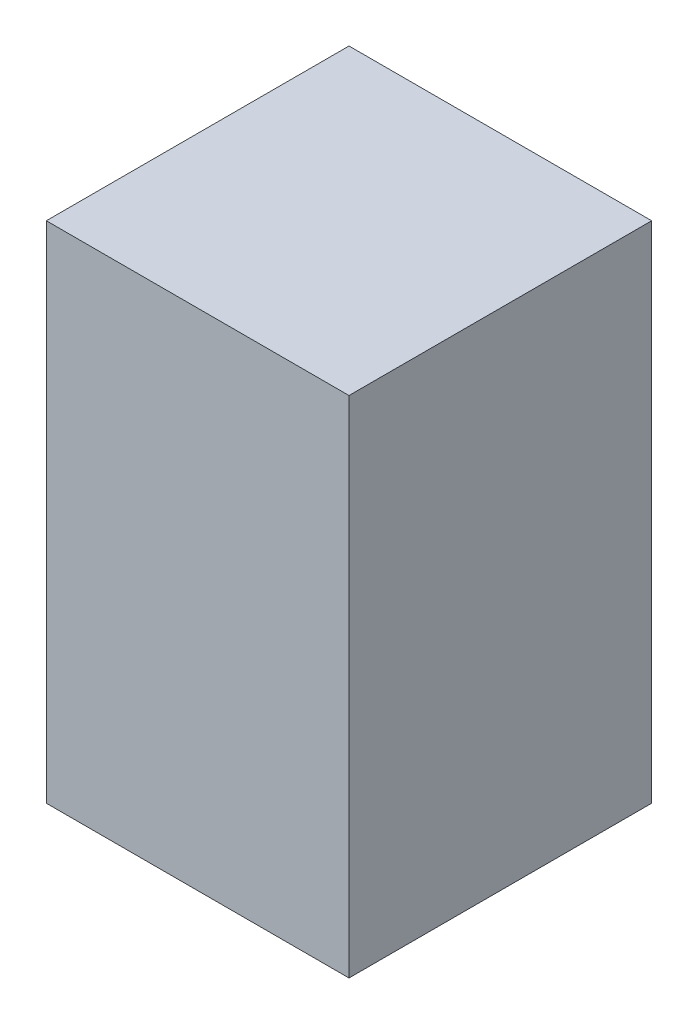
ISO-10303-21;
HEADER;
FILE_DESCRIPTION(('STEP AP214'),'2;1');
FILE_NAME('part.step','',(''),(''),'','','');
FILE_SCHEMA(('AUTOMOTIVE_DESIGN { 1 0 10303 214 1 1 1 1 }'));
ENDSEC;
DATA;
#1=APPLICATION_CONTEXT('core data for automotive mechanical design processes');
#2=APPLICATION_PROTOCOL_DEFINITION('international standard','automotive_design',2000,#1);
#3=PRODUCT_CONTEXT('',#1,'mechanical');
#4=PRODUCT('Part','Part','',(#3));
#5=PRODUCT_RELATED_PRODUCT_CATEGORY('part','',(#4));
#6=PRODUCT_DEFINITION_FORMATION('','',#4);
#7=PRODUCT_DEFINITION_CONTEXT('part definition',#1,'design');
#8=PRODUCT_DEFINITION('design','',#6,#7);
#9=PRODUCT_DEFINITION_SHAPE('','',#8);
#10=(LENGTH_UNIT() NAMED_UNIT(*) SI_UNIT(.MILLI.,.METRE.));
#11=(NAMED_UNIT(*) PLANE_ANGLE_UNIT() SI_UNIT($,.RADIAN.));
#12=(NAMED_UNIT(*) SI_UNIT($,.STERADIAN.) SOLID_ANGLE_UNIT());
#13=UNCERTAINTY_MEASURE_WITH_UNIT(LENGTH_MEASURE(1.E-05),#10,'distance_accuracy_value','');
#14=(GEOMETRIC_REPRESENTATION_CONTEXT(3) GLOBAL_UNCERTAINTY_ASSIGNED_CONTEXT((#13)) GLOBAL_UNIT_ASSIGNED_CONTEXT((#10,
#11,#12)) REPRESENTATION_CONTEXT('',''));
#15=CARTESIAN_POINT('',(0.,0.,0.));
#16=DIRECTION('',(0.,0.,1.));
#17=DIRECTION('',(1.,0.,0.));
#18=AXIS2_PLACEMENT_3D('',#15,#16,#17);
#19=CARTESIAN_POINT('',(15.,25.,30.));
#20=DIRECTION('',(-1.,0.,0.));
#21=DIRECTION('',(0.,-1.,0.));
#22=AXIS2_PLACEMENT_3D('',#19,#20,#21);
#23=PLANE('',#22);
#24=DIRECTION('',(0.,1.,0.));
#25=VECTOR('',#24,1.);
#26=CARTESIAN_POINT('',(15.,25.,0.));
#27=LINE('',#26,#25);
#28=CARTESIAN_POINT('',(15.,-25.,0.));
#29=VERTEX_POINT('',#28);
#30=CARTESIAN_POINT('',(15.,25.,0.));
#31=VERTEX_POINT('',#30);
#32=EDGE_CURVE('E96',#29,#31,#27,.T.);
#33=ORIENTED_EDGE('',*,*,#32,.T.);
#34=DIRECTION('',(0.,0.,-1.));
#35=VECTOR('',#34,1.);
#36=CARTESIAN_POINT('',(15.,25.,30.));
#37=LINE('',#36,#35);
#38=CARTESIAN_POINT('',(15.,25.,30.));
#39=VERTEX_POINT('',#38);
#40=EDGE_CURVE('E11',#39,#31,#37,.T.);
#41=ORIENTED_EDGE('',*,*,#40,.F.);
#42=DIRECTION('',(0.,1.,0.));
#43=VECTOR('',#42,1.);
#44=CARTESIAN_POINT('',(15.,25.,30.));
#45=LINE('',#44,#43);
#46=CARTESIAN_POINT('',(15.,-25.,30.));
#47=VERTEX_POINT('',#46);
#48=EDGE_CURVE('E84',#47,#39,#45,.T.);
#49=ORIENTED_EDGE('',*,*,#48,.F.);
#50=DIRECTION('',(0.,0.,-1.));
#51=VECTOR('',#50,1.);
#52=CARTESIAN_POINT('',(15.,-25.,30.));
#53=LINE('',#52,#51);
#54=EDGE_CURVE('E92',#47,#29,#53,.T.);
#55=ORIENTED_EDGE('',*,*,#54,.T.);
#56=EDGE_LOOP('',(#33,#41,#49,#55));
#57=FACE_BOUND('',#56,.T.);
#58=ADVANCED_FACE('F33',(#57),#23,.F.);
#59=CARTESIAN_POINT('',(-15.,25.,30.));
#60=DIRECTION('',(0.,-1.,0.));
#61=DIRECTION('',(0.,0.,-1.));
#62=AXIS2_PLACEMENT_3D('',#59,#60,#61);
#63=PLANE('',#62);
#64=DIRECTION('',(-1.,0.,0.));
#65=VECTOR('',#64,1.);
#66=CARTESIAN_POINT('',(-15.,25.,0.));
#67=LINE('',#66,#65);
#68=CARTESIAN_POINT('',(-15.,25.,0.));
#69=VERTEX_POINT('',#68);
#70=EDGE_CURVE('E88',#31,#69,#67,.T.);
#71=ORIENTED_EDGE('',*,*,#70,.T.);
#72=DIRECTION('',(0.,0.,-1.));
#73=VECTOR('',#72,1.);
#74=CARTESIAN_POINT('',(-15.,25.,30.));
#75=LINE('',#74,#73);
#76=CARTESIAN_POINT('',(-15.,25.,30.));
#77=VERTEX_POINT('',#76);
#78=EDGE_CURVE('E41',#77,#69,#75,.T.);
#79=ORIENTED_EDGE('',*,*,#78,.F.);
#80=DIRECTION('',(-1.,0.,0.));
#81=VECTOR('',#80,1.);
#82=CARTESIAN_POINT('',(-15.,25.,30.));
#83=LINE('',#82,#81);
#84=EDGE_CURVE('E79',#39,#77,#83,.T.);
#85=ORIENTED_EDGE('',*,*,#84,.F.);
#86=ORIENTED_EDGE('',*,*,#40,.T.);
#87=EDGE_LOOP('',(#71,#79,#85,#86));
#88=FACE_BOUND('',#87,.T.);
#89=ADVANCED_FACE('F87',(#88),#63,.F.);
#90=CARTESIAN_POINT('',(-15.,25.,30.));
#91=DIRECTION('',(1.,0.,0.));
#92=DIRECTION('',(0.,1.,0.));
#93=AXIS2_PLACEMENT_3D('',#90,#91,#92);
#94=PLANE('',#93);
#95=DIRECTION('',(0.,-1.,0.));
#96=VECTOR('',#95,1.);
#97=CARTESIAN_POINT('',(-15.,25.,0.));
#98=LINE('',#97,#96);
#99=CARTESIAN_POINT('',(-15.,-25.,0.));
#100=VERTEX_POINT('',#99);
#101=EDGE_CURVE('E66',#69,#100,#98,.T.);
#102=ORIENTED_EDGE('',*,*,#101,.T.);
#103=DIRECTION('',(0.,0.,-1.));
#104=VECTOR('',#103,1.);
#105=CARTESIAN_POINT('',(-15.,-25.,30.));
#106=LINE('',#105,#104);
#107=CARTESIAN_POINT('',(-15.,-25.,30.));
#108=VERTEX_POINT('',#107);
#109=EDGE_CURVE('E89',#108,#100,#106,.T.);
#110=ORIENTED_EDGE('',*,*,#109,.F.);
#111=DIRECTION('',(0.,-1.,0.));
#112=VECTOR('',#111,1.);
#113=CARTESIAN_POINT('',(-15.,25.,30.));
#114=LINE('',#113,#112);
#115=EDGE_CURVE('E82',#77,#108,#114,.T.);
#116=ORIENTED_EDGE('',*,*,#115,.F.);
#117=ORIENTED_EDGE('',*,*,#78,.T.);
#118=EDGE_LOOP('',(#102,#110,#116,#117));
#119=FACE_BOUND('',#118,.T.);
#120=ADVANCED_FACE('F90',(#119),#94,.F.);
#121=CARTESIAN_POINT('',(-15.,-25.,30.));
#122=DIRECTION('',(0.,1.,0.));
#123=DIRECTION('',(0.,0.,1.));
#124=AXIS2_PLACEMENT_3D('',#121,#122,#123);
#125=PLANE('',#124);
#126=DIRECTION('',(1.,0.,0.));
#127=VECTOR('',#126,1.);
#128=CARTESIAN_POINT('',(-15.,-25.,0.));
#129=LINE('',#128,#127);
#130=EDGE_CURVE('E72',#100,#29,#129,.T.);
#131=ORIENTED_EDGE('',*,*,#130,.T.);
#132=ORIENTED_EDGE('',*,*,#54,.F.);
#133=DIRECTION('',(1.,0.,0.));
#134=VECTOR('',#133,1.);
#135=CARTESIAN_POINT('',(-15.,-25.,30.));
#136=LINE('',#135,#134);
#137=EDGE_CURVE('E49',#108,#47,#136,.T.);
#138=ORIENTED_EDGE('',*,*,#137,.F.);
#139=ORIENTED_EDGE('',*,*,#109,.T.);
#140=EDGE_LOOP('',(#131,#132,#138,#139));
#141=FACE_BOUND('',#140,.T.);
#142=ADVANCED_FACE('F103',(#141),#125,.F.);
#143=CARTESIAN_POINT('',(0.,0.,30.));
#144=DIRECTION('',(0.,0.,1.));
#145=DIRECTION('',(1.,0.,0.));
#146=AXIS2_PLACEMENT_3D('',#143,#144,#145);
#147=PLANE('',#146);
#148=ORIENTED_EDGE('',*,*,#48,.T.);
#149=ORIENTED_EDGE('',*,*,#84,.T.);
#150=ORIENTED_EDGE('',*,*,#115,.T.);
#151=ORIENTED_EDGE('',*,*,#137,.T.);
#152=EDGE_LOOP('',(#148,#149,#150,#151));
#153=FACE_BOUND('',#152,.T.);
#154=ADVANCED_FACE('F80',(#153),#147,.T.);
#155=CARTESIAN_POINT('',(0.,0.,0.));
#156=DIRECTION('',(0.,0.,1.));
#157=DIRECTION('',(1.,0.,0.));
#158=AXIS2_PLACEMENT_3D('',#155,#156,#157);
#159=PLANE('',#158);
#160=ORIENTED_EDGE('',*,*,#32,.F.);
#161=ORIENTED_EDGE('',*,*,#130,.F.);
#162=ORIENTED_EDGE('',*,*,#101,.F.);
#163=ORIENTED_EDGE('',*,*,#70,.F.);
#164=EDGE_LOOP('',(#160,#161,#162,#163));
#165=FACE_BOUND('',#164,.T.);
#166=ADVANCED_FACE('F106',(#165),#159,.F.);
#167=CLOSED_SHELL('',(#58,#89,#120,#142,#154,#166));
#168=MANIFOLD_SOLID_BREP('B2',#167);
#169=ADVANCED_BREP_SHAPE_REPRESENTATION('',(#18,#168),#14);
#170=SHAPE_DEFINITION_REPRESENTATION(#9,#169);
ENDSEC;
END-ISO-10303-21;
